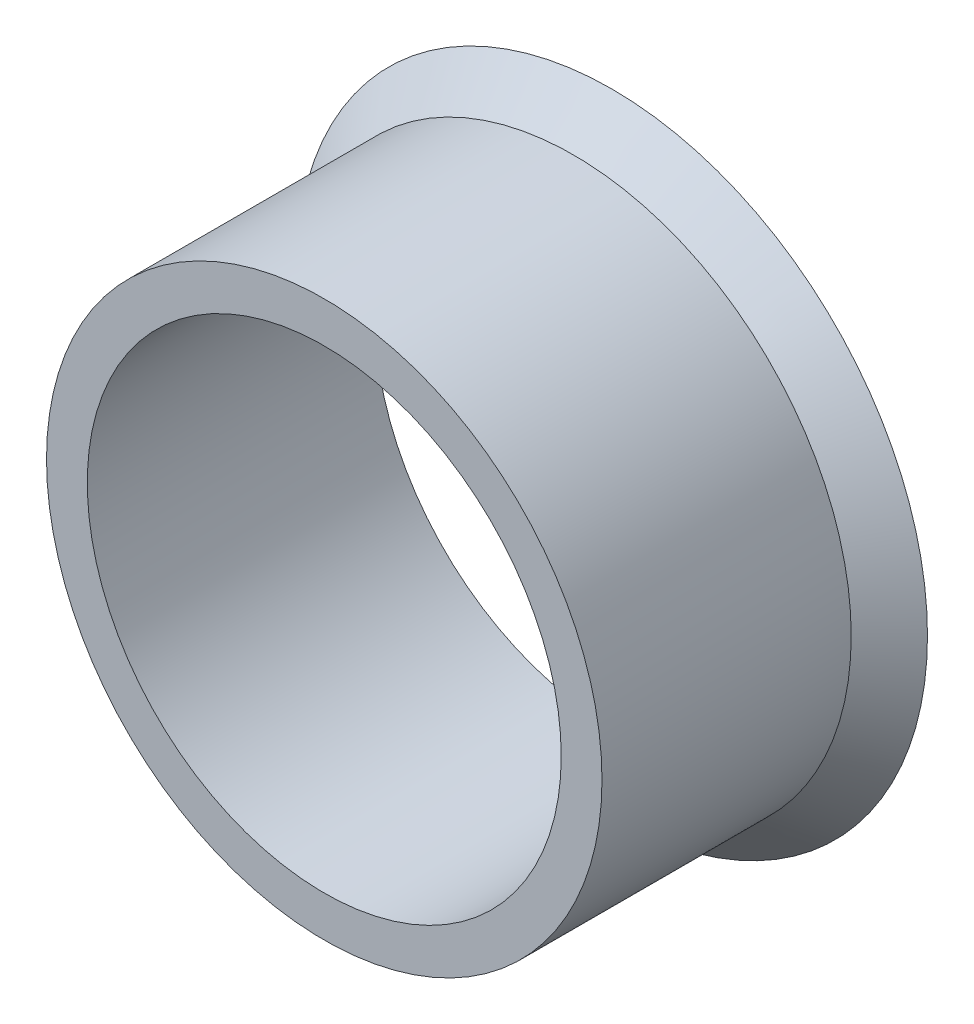
ISO-10303-21;
HEADER;
FILE_DESCRIPTION(('STEP AP214'),'2;1');
FILE_NAME('part.step','',(''),(''),'','','');
FILE_SCHEMA(('AUTOMOTIVE_DESIGN { 1 0 10303 214 1 1 1 1 }'));
ENDSEC;
DATA;
#1=APPLICATION_CONTEXT('core data for automotive mechanical design processes');
#2=APPLICATION_PROTOCOL_DEFINITION('international standard','automotive_design',2000,#1);
#3=PRODUCT_CONTEXT('',#1,'mechanical');
#4=PRODUCT('Part','Part','',(#3));
#5=PRODUCT_RELATED_PRODUCT_CATEGORY('part','',(#4));
#6=PRODUCT_DEFINITION_FORMATION('','',#4);
#7=PRODUCT_DEFINITION_CONTEXT('part definition',#1,'design');
#8=PRODUCT_DEFINITION('design','',#6,#7);
#9=PRODUCT_DEFINITION_SHAPE('','',#8);
#10=(LENGTH_UNIT() NAMED_UNIT(*) SI_UNIT(.MILLI.,.METRE.));
#11=(NAMED_UNIT(*) PLANE_ANGLE_UNIT() SI_UNIT($,.RADIAN.));
#12=(NAMED_UNIT(*) SI_UNIT($,.STERADIAN.) SOLID_ANGLE_UNIT());
#13=UNCERTAINTY_MEASURE_WITH_UNIT(LENGTH_MEASURE(1.E-05),#10,'distance_accuracy_value','');
#14=(GEOMETRIC_REPRESENTATION_CONTEXT(3) GLOBAL_UNCERTAINTY_ASSIGNED_CONTEXT((#13)) GLOBAL_UNIT_ASSIGNED_CONTEXT((#10,
#11,#12)) REPRESENTATION_CONTEXT('',''));
#15=CARTESIAN_POINT('',(0.,0.,0.));
#16=DIRECTION('',(0.,0.,1.));
#17=DIRECTION('',(1.,0.,0.));
#18=AXIS2_PLACEMENT_3D('',#15,#16,#17);
#19=CARTESIAN_POINT('',(0.,0.,24.7));
#20=DIRECTION('',(0.,0.,-1.));
#21=DIRECTION('',(-1.,0.,0.));
#22=AXIS2_PLACEMENT_3D('',#19,#20,#21);
#23=CYLINDRICAL_SURFACE('',#22,23.85);
#24=CARTESIAN_POINT('',(0.,0.,24.7));
#25=DIRECTION('',(0.,0.,1.));
#26=DIRECTION('',(1.,0.,0.));
#27=AXIS2_PLACEMENT_3D('',#24,#25,#26);
#28=CIRCLE('',#27,23.85);
#29=CARTESIAN_POINT('',(23.85,0.,24.7));
#30=VERTEX_POINT('',#29);
#31=EDGE_CURVE('E11',#30,#30,#28,.T.);
#32=ORIENTED_EDGE('',*,*,#31,.F.);
#33=EDGE_LOOP('',(#32));
#34=FACE_BOUND('',#33,.T.);
#35=CARTESIAN_POINT('',(0.,0.,3.3));
#36=DIRECTION('',(0.,0.,-1.));
#37=DIRECTION('',(-1.,0.,0.));
#38=AXIS2_PLACEMENT_3D('',#35,#36,#37);
#39=CIRCLE('',#38,23.85);
#40=CARTESIAN_POINT('',(-23.85,0.,3.3));
#41=VERTEX_POINT('',#40);
#42=EDGE_CURVE('E52',#41,#41,#39,.T.);
#43=ORIENTED_EDGE('',*,*,#42,.F.);
#44=EDGE_LOOP('',(#43));
#45=FACE_BOUND('',#44,.T.);
#46=ADVANCED_FACE('F43',(#34,#45),#23,.T.);
#47=CARTESIAN_POINT('',(0.,0.,24.7));
#48=DIRECTION('',(0.,0.,1.));
#49=DIRECTION('',(1.,0.,0.));
#50=AXIS2_PLACEMENT_3D('',#47,#48,#49);
#51=PLANE('',#50);
#52=CARTESIAN_POINT('',(0.,0.,24.7));
#53=DIRECTION('',(0.,0.,1.));
#54=DIRECTION('',(1.,0.,0.));
#55=AXIS2_PLACEMENT_3D('',#52,#53,#54);
#56=CIRCLE('',#55,20.35);
#57=CARTESIAN_POINT('',(20.35,0.,24.7));
#58=VERTEX_POINT('',#57);
#59=EDGE_CURVE('E63',#58,#58,#56,.T.);
#60=ORIENTED_EDGE('',*,*,#59,.F.);
#61=EDGE_LOOP('',(#60));
#62=FACE_BOUND('',#61,.T.);
#63=ORIENTED_EDGE('',*,*,#31,.T.);
#64=EDGE_LOOP('',(#63));
#65=FACE_BOUND('',#64,.T.);
#66=ADVANCED_FACE('F83',(#62,#65),#51,.T.);
#67=CARTESIAN_POINT('',(0.,0.,0.));
#68=DIRECTION('',(0.,0.,-1.));
#69=DIRECTION('',(-1.,0.,0.));
#70=AXIS2_PLACEMENT_3D('',#67,#68,#69);
#71=CONICAL_SURFACE('',#70,27.1,0.777764723879955);
#72=ORIENTED_EDGE('',*,*,#42,.T.);
#73=EDGE_LOOP('',(#72));
#74=FACE_BOUND('',#73,.T.);
#75=CARTESIAN_POINT('',(0.,0.,0.));
#76=DIRECTION('',(0.,0.,-1.));
#77=DIRECTION('',(-1.,0.,0.));
#78=AXIS2_PLACEMENT_3D('',#75,#76,#77);
#79=CIRCLE('',#78,27.1);
#80=CARTESIAN_POINT('',(-27.1,0.,0.));
#81=VERTEX_POINT('',#80);
#82=EDGE_CURVE('E57',#81,#81,#79,.T.);
#83=ORIENTED_EDGE('',*,*,#82,.F.);
#84=EDGE_LOOP('',(#83));
#85=FACE_BOUND('',#84,.T.);
#86=ADVANCED_FACE('F80',(#74,#85),#71,.T.);
#87=CARTESIAN_POINT('',(0.,0.,0.));
#88=DIRECTION('',(0.,0.,1.));
#89=DIRECTION('',(1.,0.,0.));
#90=AXIS2_PLACEMENT_3D('',#87,#88,#89);
#91=PLANE('',#90);
#92=CARTESIAN_POINT('',(0.,0.,0.));
#93=DIRECTION('',(0.,0.,1.));
#94=DIRECTION('',(1.,0.,0.));
#95=AXIS2_PLACEMENT_3D('',#92,#93,#94);
#96=CIRCLE('',#95,20.35);
#97=CARTESIAN_POINT('',(20.35,0.,0.));
#98=VERTEX_POINT('',#97);
#99=EDGE_CURVE('E47',#98,#98,#96,.T.);
#100=ORIENTED_EDGE('',*,*,#99,.T.);
#101=EDGE_LOOP('',(#100));
#102=FACE_BOUND('',#101,.T.);
#103=ORIENTED_EDGE('',*,*,#82,.T.);
#104=EDGE_LOOP('',(#103));
#105=FACE_BOUND('',#104,.T.);
#106=ADVANCED_FACE('F45',(#102,#105),#91,.F.);
#107=CARTESIAN_POINT('',(0.,0.,-25.3));
#108=DIRECTION('',(0.,0.,1.));
#109=DIRECTION('',(1.,0.,0.));
#110=AXIS2_PLACEMENT_3D('',#107,#108,#109);
#111=CYLINDRICAL_SURFACE('',#110,20.35);
#112=ORIENTED_EDGE('',*,*,#59,.T.);
#113=EDGE_LOOP('',(#112));
#114=FACE_BOUND('',#113,.T.);
#115=ORIENTED_EDGE('',*,*,#99,.F.);
#116=EDGE_LOOP('',(#115));
#117=FACE_BOUND('',#116,.T.);
#118=ADVANCED_FACE('F74',(#114,#117),#111,.F.);
#119=CLOSED_SHELL('',(#46,#66,#86,#106,#118));
#120=MANIFOLD_SOLID_BREP('B2',#119);
#121=ADVANCED_BREP_SHAPE_REPRESENTATION('',(#18,#120),#14);
#122=SHAPE_DEFINITION_REPRESENTATION(#9,#121);
ENDSEC;
END-ISO-10303-21;
